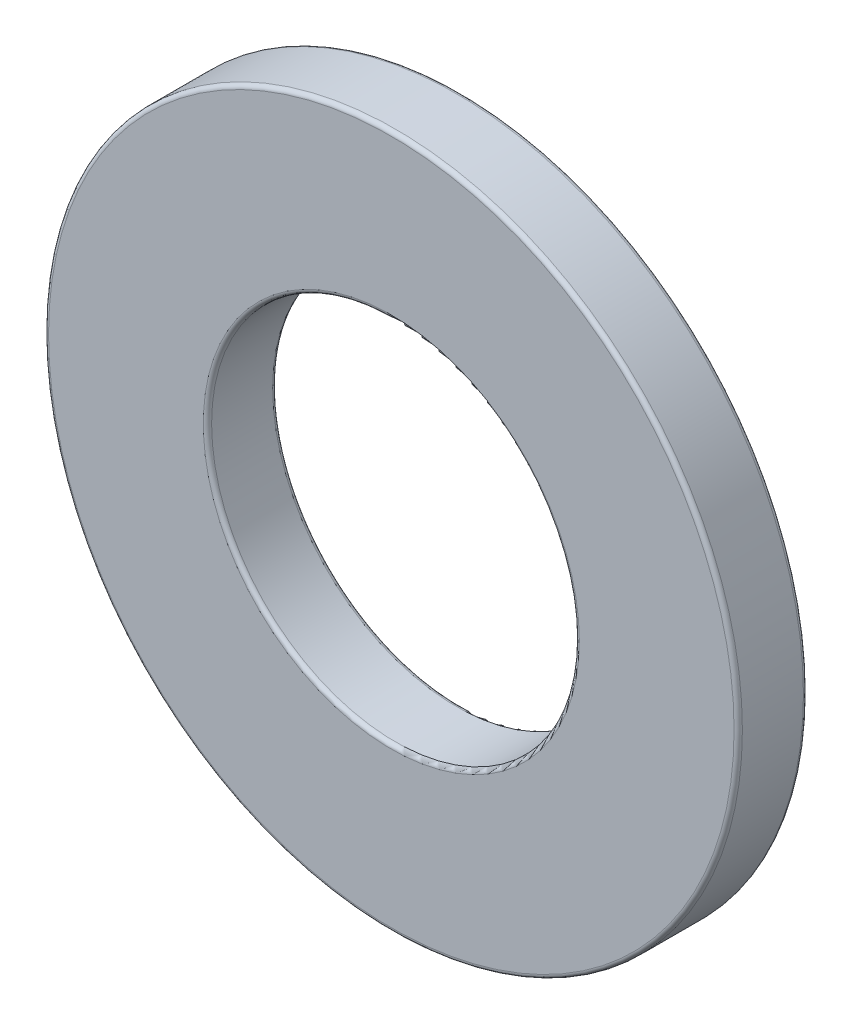
ISO-10303-21;
HEADER;
FILE_DESCRIPTION(('STEP AP214'),'2;1');
FILE_NAME('part.step','',(''),(''),'','','');
FILE_SCHEMA(('AUTOMOTIVE_DESIGN { 1 0 10303 214 1 1 1 1 }'));
ENDSEC;
DATA;
#1=APPLICATION_CONTEXT('core data for automotive mechanical design processes');
#2=APPLICATION_PROTOCOL_DEFINITION('international standard','automotive_design',2000,#1);
#3=PRODUCT_CONTEXT('',#1,'mechanical');
#4=PRODUCT('Part','Part','',(#3));
#5=PRODUCT_RELATED_PRODUCT_CATEGORY('part','',(#4));
#6=PRODUCT_DEFINITION_FORMATION('','',#4);
#7=PRODUCT_DEFINITION_CONTEXT('part definition',#1,'design');
#8=PRODUCT_DEFINITION('design','',#6,#7);
#9=PRODUCT_DEFINITION_SHAPE('','',#8);
#10=(LENGTH_UNIT() NAMED_UNIT(*) SI_UNIT(.MILLI.,.METRE.));
#11=(NAMED_UNIT(*) PLANE_ANGLE_UNIT() SI_UNIT($,.RADIAN.));
#12=(NAMED_UNIT(*) SI_UNIT($,.STERADIAN.) SOLID_ANGLE_UNIT());
#13=UNCERTAINTY_MEASURE_WITH_UNIT(LENGTH_MEASURE(1.E-05),#10,'distance_accuracy_value','');
#14=(GEOMETRIC_REPRESENTATION_CONTEXT(3) GLOBAL_UNCERTAINTY_ASSIGNED_CONTEXT((#13)) GLOBAL_UNIT_ASSIGNED_CONTEXT((#10,
#11,#12)) REPRESENTATION_CONTEXT('',''));
#15=CARTESIAN_POINT('',(0.,0.,0.));
#16=DIRECTION('',(0.,0.,1.));
#17=DIRECTION('',(1.,0.,0.));
#18=AXIS2_PLACEMENT_3D('',#15,#16,#17);
#19=CARTESIAN_POINT('',(0.,0.,-0.499999999999999));
#20=DIRECTION('',(0.,0.,1.));
#21=DIRECTION('',(1.,0.,0.));
#22=AXIS2_PLACEMENT_3D('',#19,#20,#21);
#23=CYLINDRICAL_SURFACE('',#22,5.);
#24=CARTESIAN_POINT('',(0.,0.,0.440000000000001));
#25=DIRECTION('',(0.,0.,1.));
#26=DIRECTION('',(1.,0.,0.));
#27=AXIS2_PLACEMENT_3D('',#24,#25,#26);
#28=CIRCLE('',#27,5.);
#29=CARTESIAN_POINT('',(5.,0.,0.440000000000001));
#30=VERTEX_POINT('',#29);
#31=EDGE_CURVE('E64',#30,#30,#28,.F.);
#32=ORIENTED_EDGE('',*,*,#31,.T.);
#33=EDGE_LOOP('',(#32));
#34=FACE_BOUND('',#33,.T.);
#35=CARTESIAN_POINT('',(0.,0.,-0.439999999999999));
#36=DIRECTION('',(0.,0.,1.));
#37=DIRECTION('',(1.,0.,0.));
#38=AXIS2_PLACEMENT_3D('',#35,#36,#37);
#39=CIRCLE('',#38,5.);
#40=CARTESIAN_POINT('',(5.,0.,-0.439999999999999));
#41=VERTEX_POINT('',#40);
#42=EDGE_CURVE('E68',#41,#41,#39,.T.);
#43=ORIENTED_EDGE('',*,*,#42,.T.);
#44=EDGE_LOOP('',(#43));
#45=FACE_BOUND('',#44,.T.);
#46=ADVANCED_FACE('F38',(#34,#45),#23,.T.);
#47=CARTESIAN_POINT('',(0.,0.,-0.499999999999999));
#48=DIRECTION('',(0.,0.,1.));
#49=DIRECTION('',(1.,0.,0.));
#50=AXIS2_PLACEMENT_3D('',#47,#48,#49);
#51=PLANE('',#50);
#52=CARTESIAN_POINT('',(0.,0.,-0.499999999999999));
#53=DIRECTION('',(0.,0.,1.));
#54=DIRECTION('',(1.,0.,0.));
#55=AXIS2_PLACEMENT_3D('',#52,#53,#54);
#56=CIRCLE('',#55,4.94);
#57=CARTESIAN_POINT('',(4.94,0.,-0.499999999999999));
#58=VERTEX_POINT('',#57);
#59=EDGE_CURVE('E52',#58,#58,#56,.F.);
#60=ORIENTED_EDGE('',*,*,#59,.T.);
#61=EDGE_LOOP('',(#60));
#62=FACE_BOUND('',#61,.T.);
#63=CARTESIAN_POINT('',(0.,0.,-0.499999999999999));
#64=DIRECTION('',(0.,0.,1.));
#65=DIRECTION('',(1.,0.,0.));
#66=AXIS2_PLACEMENT_3D('',#63,#64,#65);
#67=CIRCLE('',#66,2.71);
#68=CARTESIAN_POINT('',(2.71,0.,-0.499999999999999));
#69=VERTEX_POINT('',#68);
#70=EDGE_CURVE('E58',#69,#69,#67,.T.);
#71=ORIENTED_EDGE('',*,*,#70,.T.);
#72=EDGE_LOOP('',(#71));
#73=FACE_BOUND('',#72,.T.);
#74=ADVANCED_FACE('F97',(#62,#73),#51,.F.);
#75=CARTESIAN_POINT('',(0.,0.,0.500000000000001));
#76=DIRECTION('',(0.,0.,1.));
#77=DIRECTION('',(1.,0.,0.));
#78=AXIS2_PLACEMENT_3D('',#75,#76,#77);
#79=PLANE('',#78);
#80=CARTESIAN_POINT('',(0.,0.,0.500000000000001));
#81=DIRECTION('',(0.,0.,1.));
#82=DIRECTION('',(1.,0.,0.));
#83=AXIS2_PLACEMENT_3D('',#80,#81,#82);
#84=CIRCLE('',#83,4.94);
#85=CARTESIAN_POINT('',(4.94,0.,0.500000000000001));
#86=VERTEX_POINT('',#85);
#87=EDGE_CURVE('E72',#86,#86,#84,.T.);
#88=ORIENTED_EDGE('',*,*,#87,.T.);
#89=EDGE_LOOP('',(#88));
#90=FACE_BOUND('',#89,.T.);
#91=CARTESIAN_POINT('',(0.,0.,0.500000000000001));
#92=DIRECTION('',(0.,0.,1.));
#93=DIRECTION('',(1.,0.,0.));
#94=AXIS2_PLACEMENT_3D('',#91,#92,#93);
#95=CIRCLE('',#94,2.71);
#96=CARTESIAN_POINT('',(2.71,0.,0.500000000000001));
#97=VERTEX_POINT('',#96);
#98=EDGE_CURVE('E76',#97,#97,#95,.F.);
#99=ORIENTED_EDGE('',*,*,#98,.T.);
#100=EDGE_LOOP('',(#99));
#101=FACE_BOUND('',#100,.T.);
#102=ADVANCED_FACE('F82',(#90,#101),#79,.T.);
#103=CARTESIAN_POINT('',(0.,0.,-0.499999999999999));
#104=DIRECTION('',(0.,0.,1.));
#105=DIRECTION('',(1.,0.,0.));
#106=AXIS2_PLACEMENT_3D('',#103,#104,#105);
#107=CYLINDRICAL_SURFACE('',#106,2.65);
#108=CARTESIAN_POINT('',(0.,0.,0.440000000000001));
#109=DIRECTION('',(0.,0.,1.));
#110=DIRECTION('',(1.,0.,0.));
#111=AXIS2_PLACEMENT_3D('',#108,#109,#110);
#112=CIRCLE('',#111,2.65);
#113=CARTESIAN_POINT('',(2.65,0.,0.440000000000001));
#114=VERTEX_POINT('',#113);
#115=EDGE_CURVE('E10',#114,#114,#112,.T.);
#116=ORIENTED_EDGE('',*,*,#115,.T.);
#117=EDGE_LOOP('',(#116));
#118=FACE_BOUND('',#117,.T.);
#119=CARTESIAN_POINT('',(0.,0.,-0.439999999999999));
#120=DIRECTION('',(0.,0.,1.));
#121=DIRECTION('',(1.,0.,0.));
#122=AXIS2_PLACEMENT_3D('',#119,#120,#121);
#123=CIRCLE('',#122,2.65);
#124=CARTESIAN_POINT('',(2.65,0.,-0.439999999999999));
#125=VERTEX_POINT('',#124);
#126=EDGE_CURVE('E46',#125,#125,#123,.F.);
#127=ORIENTED_EDGE('',*,*,#126,.T.);
#128=EDGE_LOOP('',(#127));
#129=FACE_BOUND('',#128,.T.);
#130=ADVANCED_FACE('F109',(#118,#129),#107,.F.);
#131=CARTESIAN_POINT('',(0.,0.,0.440000000000001));
#132=DIRECTION('',(0.,0.,1.));
#133=DIRECTION('',(1.,0.,0.));
#134=AXIS2_PLACEMENT_3D('',#131,#132,#133);
#135=TOROIDAL_SURFACE('',#134,4.94,0.06);
#136=ORIENTED_EDGE('',*,*,#31,.F.);
#137=EDGE_LOOP('',(#136));
#138=FACE_BOUND('',#137,.T.);
#139=ORIENTED_EDGE('',*,*,#87,.F.);
#140=EDGE_LOOP('',(#139));
#141=FACE_BOUND('',#140,.T.);
#142=ADVANCED_FACE('F93',(#138,#141),#135,.T.);
#143=CARTESIAN_POINT('',(0.,0.,-0.439999999999999));
#144=DIRECTION('',(0.,0.,1.));
#145=DIRECTION('',(1.,0.,0.));
#146=AXIS2_PLACEMENT_3D('',#143,#144,#145);
#147=TOROIDAL_SURFACE('',#146,4.94,0.06);
#148=ORIENTED_EDGE('',*,*,#59,.F.);
#149=EDGE_LOOP('',(#148));
#150=FACE_BOUND('',#149,.T.);
#151=ORIENTED_EDGE('',*,*,#42,.F.);
#152=EDGE_LOOP('',(#151));
#153=FACE_BOUND('',#152,.T.);
#154=ADVANCED_FACE('F87',(#150,#153),#147,.T.);
#155=CARTESIAN_POINT('',(0.,0.,0.440000000000001));
#156=DIRECTION('',(0.,0.,1.));
#157=DIRECTION('',(1.,0.,0.));
#158=AXIS2_PLACEMENT_3D('',#155,#156,#157);
#159=TOROIDAL_SURFACE('',#158,2.71,0.06);
#160=ORIENTED_EDGE('',*,*,#98,.F.);
#161=EDGE_LOOP('',(#160));
#162=FACE_BOUND('',#161,.T.);
#163=ORIENTED_EDGE('',*,*,#115,.F.);
#164=EDGE_LOOP('',(#163));
#165=FACE_BOUND('',#164,.T.);
#166=ADVANCED_FACE('F84',(#162,#165),#159,.T.);
#167=CARTESIAN_POINT('',(0.,0.,-0.439999999999999));
#168=DIRECTION('',(0.,0.,1.));
#169=DIRECTION('',(1.,0.,0.));
#170=AXIS2_PLACEMENT_3D('',#167,#168,#169);
#171=TOROIDAL_SURFACE('',#170,2.71,0.06);
#172=ORIENTED_EDGE('',*,*,#126,.F.);
#173=EDGE_LOOP('',(#172));
#174=FACE_BOUND('',#173,.T.);
#175=ORIENTED_EDGE('',*,*,#70,.F.);
#176=EDGE_LOOP('',(#175));
#177=FACE_BOUND('',#176,.T.);
#178=ADVANCED_FACE('F40',(#174,#177),#171,.T.);
#179=CLOSED_SHELL('',(#46,#74,#102,#130,#142,#154,#166,#178));
#180=MANIFOLD_SOLID_BREP('B2',#179);
#181=ADVANCED_BREP_SHAPE_REPRESENTATION('',(#18,#180),#14);
#182=SHAPE_DEFINITION_REPRESENTATION(#9,#181);
ENDSEC;
END-ISO-10303-21;
